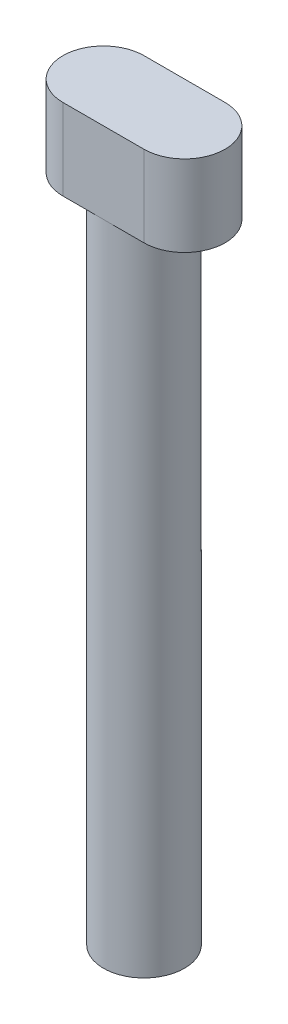
ISO-10303-21;
HEADER;
FILE_DESCRIPTION(('STEP AP214'),'2;1');
FILE_NAME('part.step','',(''),(''),'','','');
FILE_SCHEMA(('AUTOMOTIVE_DESIGN { 1 0 10303 214 1 1 1 1 }'));
ENDSEC;
DATA;
#1=APPLICATION_CONTEXT('core data for automotive mechanical design processes');
#2=APPLICATION_PROTOCOL_DEFINITION('international standard','automotive_design',2000,#1);
#3=PRODUCT_CONTEXT('',#1,'mechanical');
#4=PRODUCT('Part','Part','',(#3));
#5=PRODUCT_RELATED_PRODUCT_CATEGORY('part','',(#4));
#6=PRODUCT_DEFINITION_FORMATION('','',#4);
#7=PRODUCT_DEFINITION_CONTEXT('part definition',#1,'design');
#8=PRODUCT_DEFINITION('design','',#6,#7);
#9=PRODUCT_DEFINITION_SHAPE('','',#8);
#10=(LENGTH_UNIT() NAMED_UNIT(*) SI_UNIT(.MILLI.,.METRE.));
#11=(NAMED_UNIT(*) PLANE_ANGLE_UNIT() SI_UNIT($,.RADIAN.));
#12=(NAMED_UNIT(*) SI_UNIT($,.STERADIAN.) SOLID_ANGLE_UNIT());
#13=UNCERTAINTY_MEASURE_WITH_UNIT(LENGTH_MEASURE(1.E-05),#10,'distance_accuracy_value','');
#14=(GEOMETRIC_REPRESENTATION_CONTEXT(3) GLOBAL_UNCERTAINTY_ASSIGNED_CONTEXT((#13)) GLOBAL_UNIT_ASSIGNED_CONTEXT((#10,
#11,#12)) REPRESENTATION_CONTEXT('',''));
#15=CARTESIAN_POINT('',(0.,0.,0.));
#16=DIRECTION('',(0.,0.,1.));
#17=DIRECTION('',(1.,0.,0.));
#18=AXIS2_PLACEMENT_3D('',#15,#16,#17);
#19=CARTESIAN_POINT('',(-5.49926131403118,-101.6,0.));
#20=DIRECTION('',(1.,0.,0.));
#21=DIRECTION('',(0.,0.,-1.));
#22=AXIS2_PLACEMENT_3D('',#19,#20,#21);
#23=PLANE('',#22);
#24=DIRECTION('',(0.,0.,-1.));
#25=VECTOR('',#24,1.);
#26=CARTESIAN_POINT('',(-5.49926131403118,0.,0.));
#27=LINE('',#26,#25);
#28=CARTESIAN_POINT('',(-5.49926131403118,0.,3.175));
#29=VERTEX_POINT('',#28);
#30=CARTESIAN_POINT('',(-5.49926131403118,0.,-3.175));
#31=VERTEX_POINT('',#30);
#32=EDGE_CURVE('E126',#29,#31,#27,.T.);
#33=ORIENTED_EDGE('',*,*,#32,.T.);
#34=DIRECTION('',(0.,1.,0.));
#35=VECTOR('',#34,1.);
#36=CARTESIAN_POINT('',(-5.49926131403118,-101.6,-3.175));
#37=LINE('',#36,#35);
#38=CARTESIAN_POINT('',(-5.49926131403118,-101.6,-3.175));
#39=VERTEX_POINT('',#38);
#40=EDGE_CURVE('E11',#39,#31,#37,.T.);
#41=ORIENTED_EDGE('',*,*,#40,.F.);
#42=DIRECTION('',(0.,0.,-1.));
#43=VECTOR('',#42,1.);
#44=CARTESIAN_POINT('',(-5.49926131403118,-101.6,0.));
#45=LINE('',#44,#43);
#46=CARTESIAN_POINT('',(-5.49926131403118,-101.6,3.175));
#47=VERTEX_POINT('',#46);
#48=EDGE_CURVE('E135',#47,#39,#45,.T.);
#49=ORIENTED_EDGE('',*,*,#48,.F.);
#50=DIRECTION('',(0.,1.,0.));
#51=VECTOR('',#50,1.);
#52=CARTESIAN_POINT('',(-5.49926131403118,-101.6,3.175));
#53=LINE('',#52,#51);
#54=EDGE_CURVE('E42',#47,#29,#53,.T.);
#55=ORIENTED_EDGE('',*,*,#54,.T.);
#56=EDGE_LOOP('',(#33,#41,#49,#55));
#57=FACE_BOUND('',#56,.T.);
#58=ADVANCED_FACE('F39',(#57),#23,.F.);
#59=CARTESIAN_POINT('',(0.,-101.6,0.));
#60=DIRECTION('',(0.,1.,0.));
#61=DIRECTION('',(0.,0.,1.));
#62=AXIS2_PLACEMENT_3D('',#59,#60,#61);
#63=CYLINDRICAL_SURFACE('',#62,6.35);
#64=CARTESIAN_POINT('',(0.,0.,0.));
#65=DIRECTION('',(0.,1.,0.));
#66=DIRECTION('',(0.,0.,1.));
#67=AXIS2_PLACEMENT_3D('',#64,#65,#66);
#68=CIRCLE('',#67,6.35);
#69=CARTESIAN_POINT('',(0.,0.,6.35));
#70=VERTEX_POINT('',#69);
#71=EDGE_CURVE('E139',#29,#70,#68,.T.);
#72=ORIENTED_EDGE('',*,*,#71,.F.);
#73=ORIENTED_EDGE('',*,*,#54,.F.);
#74=CARTESIAN_POINT('',(0.,-101.6,0.));
#75=DIRECTION('',(0.,1.,0.));
#76=DIRECTION('',(0.,0.,1.));
#77=AXIS2_PLACEMENT_3D('',#74,#75,#76);
#78=CIRCLE('',#77,6.35);
#79=EDGE_CURVE('E138',#47,#39,#78,.T.);
#80=ORIENTED_EDGE('',*,*,#79,.T.);
#81=ORIENTED_EDGE('',*,*,#40,.T.);
#82=CARTESIAN_POINT('',(0.,0.,-6.35));
#83=VERTEX_POINT('',#82);
#84=EDGE_CURVE('E53',#83,#31,#68,.T.);
#85=ORIENTED_EDGE('',*,*,#84,.F.);
#86=EDGE_CURVE('E57',#70,#83,#68,.T.);
#87=ORIENTED_EDGE('',*,*,#86,.F.);
#88=EDGE_LOOP('',(#72,#73,#80,#81,#85,#87));
#89=FACE_BOUND('',#88,.T.);
#90=ADVANCED_FACE('F192',(#89),#63,.T.);
#91=CARTESIAN_POINT('',(0.,-101.6,0.));
#92=DIRECTION('',(0.,1.,0.));
#93=DIRECTION('',(0.,0.,1.));
#94=AXIS2_PLACEMENT_3D('',#91,#92,#93);
#95=PLANE('',#94);
#96=ORIENTED_EDGE('',*,*,#48,.T.);
#97=ORIENTED_EDGE('',*,*,#79,.F.);
#98=EDGE_LOOP('',(#96,#97));
#99=FACE_BOUND('',#98,.T.);
#100=ADVANCED_FACE('F185',(#99),#95,.F.);
#101=CARTESIAN_POINT('',(-6.35,0.,0.));
#102=DIRECTION('',(0.,1.,0.));
#103=DIRECTION('',(0.,0.,1.));
#104=AXIS2_PLACEMENT_3D('',#101,#102,#103);
#105=PLANE('',#104);
#106=DIRECTION('',(1.,0.,0.));
#107=VECTOR('',#106,1.);
#108=CARTESIAN_POINT('',(-6.35,0.,6.35));
#109=LINE('',#108,#107);
#110=CARTESIAN_POINT('',(6.35,0.,6.35));
#111=VERTEX_POINT('',#110);
#112=EDGE_CURVE('E176',#70,#111,#109,.T.);
#113=ORIENTED_EDGE('',*,*,#112,.F.);
#114=ORIENTED_EDGE('',*,*,#86,.T.);
#115=DIRECTION('',(-1.,0.,0.));
#116=VECTOR('',#115,1.);
#117=CARTESIAN_POINT('',(-6.35,0.,-6.35));
#118=LINE('',#117,#116);
#119=CARTESIAN_POINT('',(6.35,0.,-6.35));
#120=VERTEX_POINT('',#119);
#121=EDGE_CURVE('E120',#120,#83,#118,.T.);
#122=ORIENTED_EDGE('',*,*,#121,.F.);
#123=CARTESIAN_POINT('',(6.35,0.,0.));
#124=DIRECTION('',(0.,1.,0.));
#125=DIRECTION('',(0.,0.,1.));
#126=AXIS2_PLACEMENT_3D('',#123,#124,#125);
#127=CIRCLE('',#126,6.35);
#128=EDGE_CURVE('E155',#111,#120,#127,.T.);
#129=ORIENTED_EDGE('',*,*,#128,.F.);
#130=EDGE_LOOP('',(#113,#114,#122,#129));
#131=FACE_BOUND('',#130,.T.);
#132=ADVANCED_FACE('F183',(#131),#105,.F.);
#133=CARTESIAN_POINT('',(-6.35,12.7,0.));
#134=DIRECTION('',(0.,-1.,0.));
#135=DIRECTION('',(0.,0.,-1.));
#136=AXIS2_PLACEMENT_3D('',#133,#134,#135);
#137=CYLINDRICAL_SURFACE('',#136,6.35);
#138=CARTESIAN_POINT('',(-6.35,0.,0.));
#139=DIRECTION('',(0.,1.,0.));
#140=DIRECTION('',(0.,0.,1.));
#141=AXIS2_PLACEMENT_3D('',#138,#139,#140);
#142=CIRCLE('',#141,6.35);
#143=CARTESIAN_POINT('',(-6.35,0.,-6.35));
#144=VERTEX_POINT('',#143);
#145=CARTESIAN_POINT('',(-6.35,0.,6.35));
#146=VERTEX_POINT('',#145);
#147=EDGE_CURVE('E124',#144,#146,#142,.T.);
#148=ORIENTED_EDGE('',*,*,#147,.T.);
#149=DIRECTION('',(0.,-1.,0.));
#150=VECTOR('',#149,1.);
#151=CARTESIAN_POINT('',(-6.35,12.7,6.35));
#152=LINE('',#151,#150);
#153=CARTESIAN_POINT('',(-6.35,12.7,6.35));
#154=VERTEX_POINT('',#153);
#155=EDGE_CURVE('E102',#154,#146,#152,.T.);
#156=ORIENTED_EDGE('',*,*,#155,.F.);
#157=CARTESIAN_POINT('',(-6.35,12.7,0.));
#158=DIRECTION('',(0.,1.,0.));
#159=DIRECTION('',(0.,0.,1.));
#160=AXIS2_PLACEMENT_3D('',#157,#158,#159);
#161=CIRCLE('',#160,6.35);
#162=CARTESIAN_POINT('',(-6.35,12.7,-6.35));
#163=VERTEX_POINT('',#162);
#164=EDGE_CURVE('E110',#163,#154,#161,.T.);
#165=ORIENTED_EDGE('',*,*,#164,.F.);
#166=DIRECTION('',(0.,-1.,0.));
#167=VECTOR('',#166,1.);
#168=CARTESIAN_POINT('',(-6.35,12.7,-6.35));
#169=LINE('',#168,#167);
#170=EDGE_CURVE('E167',#163,#144,#169,.T.);
#171=ORIENTED_EDGE('',*,*,#170,.T.);
#172=EDGE_LOOP('',(#148,#156,#165,#171));
#173=FACE_BOUND('',#172,.T.);
#174=ADVANCED_FACE('F122',(#173),#137,.T.);
#175=CARTESIAN_POINT('',(-6.35,12.7,6.35));
#176=DIRECTION('',(0.,0.,-1.));
#177=DIRECTION('',(-1.,0.,0.));
#178=AXIS2_PLACEMENT_3D('',#175,#176,#177);
#179=PLANE('',#178);
#180=EDGE_CURVE('E177',#146,#70,#109,.T.);
#181=ORIENTED_EDGE('',*,*,#180,.T.);
#182=ORIENTED_EDGE('',*,*,#112,.T.);
#183=DIRECTION('',(0.,-1.,0.));
#184=VECTOR('',#183,1.);
#185=CARTESIAN_POINT('',(6.35,12.7,6.35));
#186=LINE('',#185,#184);
#187=CARTESIAN_POINT('',(6.35,12.7,6.35));
#188=VERTEX_POINT('',#187);
#189=EDGE_CURVE('E105',#188,#111,#186,.T.);
#190=ORIENTED_EDGE('',*,*,#189,.F.);
#191=DIRECTION('',(1.,0.,0.));
#192=VECTOR('',#191,1.);
#193=CARTESIAN_POINT('',(-6.35,12.7,6.35));
#194=LINE('',#193,#192);
#195=EDGE_CURVE('E97',#154,#188,#194,.T.);
#196=ORIENTED_EDGE('',*,*,#195,.F.);
#197=ORIENTED_EDGE('',*,*,#155,.T.);
#198=EDGE_LOOP('',(#181,#182,#190,#196,#197));
#199=FACE_BOUND('',#198,.T.);
#200=ADVANCED_FACE('F100',(#199),#179,.F.);
#201=CARTESIAN_POINT('',(6.35,12.7,0.));
#202=DIRECTION('',(0.,-1.,0.));
#203=DIRECTION('',(0.,0.,-1.));
#204=AXIS2_PLACEMENT_3D('',#201,#202,#203);
#205=CYLINDRICAL_SURFACE('',#204,6.35);
#206=ORIENTED_EDGE('',*,*,#128,.T.);
#207=DIRECTION('',(0.,-1.,0.));
#208=VECTOR('',#207,1.);
#209=CARTESIAN_POINT('',(6.35,12.7,-6.35));
#210=LINE('',#209,#208);
#211=CARTESIAN_POINT('',(6.35,12.7,-6.35));
#212=VERTEX_POINT('',#211);
#213=EDGE_CURVE('E131',#212,#120,#210,.T.);
#214=ORIENTED_EDGE('',*,*,#213,.F.);
#215=CARTESIAN_POINT('',(6.35,12.7,0.));
#216=DIRECTION('',(0.,1.,0.));
#217=DIRECTION('',(0.,0.,1.));
#218=AXIS2_PLACEMENT_3D('',#215,#216,#217);
#219=CIRCLE('',#218,6.35);
#220=EDGE_CURVE('E109',#188,#212,#219,.T.);
#221=ORIENTED_EDGE('',*,*,#220,.F.);
#222=ORIENTED_EDGE('',*,*,#189,.T.);
#223=EDGE_LOOP('',(#206,#214,#221,#222));
#224=FACE_BOUND('',#223,.T.);
#225=ADVANCED_FACE('F182',(#224),#205,.T.);
#226=CARTESIAN_POINT('',(-6.35,12.7,-6.35));
#227=DIRECTION('',(0.,0.,1.));
#228=DIRECTION('',(1.,0.,0.));
#229=AXIS2_PLACEMENT_3D('',#226,#227,#228);
#230=PLANE('',#229);
#231=ORIENTED_EDGE('',*,*,#121,.T.);
#232=EDGE_CURVE('E151',#83,#144,#118,.T.);
#233=ORIENTED_EDGE('',*,*,#232,.T.);
#234=ORIENTED_EDGE('',*,*,#170,.F.);
#235=DIRECTION('',(-1.,0.,0.));
#236=VECTOR('',#235,1.);
#237=CARTESIAN_POINT('',(-6.35,12.7,-6.35));
#238=LINE('',#237,#236);
#239=EDGE_CURVE('E115',#212,#163,#238,.T.);
#240=ORIENTED_EDGE('',*,*,#239,.F.);
#241=ORIENTED_EDGE('',*,*,#213,.T.);
#242=EDGE_LOOP('',(#231,#233,#234,#240,#241));
#243=FACE_BOUND('',#242,.T.);
#244=ADVANCED_FACE('F159',(#243),#230,.F.);
#245=CARTESIAN_POINT('',(-6.35,12.7,0.));
#246=DIRECTION('',(0.,1.,0.));
#247=DIRECTION('',(0.,0.,1.));
#248=AXIS2_PLACEMENT_3D('',#245,#246,#247);
#249=PLANE('',#248);
#250=ORIENTED_EDGE('',*,*,#164,.T.);
#251=ORIENTED_EDGE('',*,*,#195,.T.);
#252=ORIENTED_EDGE('',*,*,#220,.T.);
#253=ORIENTED_EDGE('',*,*,#239,.T.);
#254=EDGE_LOOP('',(#250,#251,#252,#253));
#255=FACE_BOUND('',#254,.T.);
#256=ADVANCED_FACE('F113',(#255),#249,.T.);
#257=ORIENTED_EDGE('',*,*,#32,.F.);
#258=ORIENTED_EDGE('',*,*,#71,.T.);
#259=ORIENTED_EDGE('',*,*,#180,.F.);
#260=ORIENTED_EDGE('',*,*,#147,.F.);
#261=ORIENTED_EDGE('',*,*,#232,.F.);
#262=ORIENTED_EDGE('',*,*,#84,.T.);
#263=EDGE_LOOP('',(#257,#258,#259,#260,#261,#262));
#264=FACE_BOUND('',#263,.T.);
#265=ADVANCED_FACE('F150',(#264),#105,.F.);
#266=CLOSED_SHELL('',(#58,#90,#100,#132,#174,#200,#225,#244,#256,#265));
#267=MANIFOLD_SOLID_BREP('B2',#266);
#268=ADVANCED_BREP_SHAPE_REPRESENTATION('',(#18,#267),#14);
#269=SHAPE_DEFINITION_REPRESENTATION(#9,#268);
ENDSEC;
END-ISO-10303-21;
